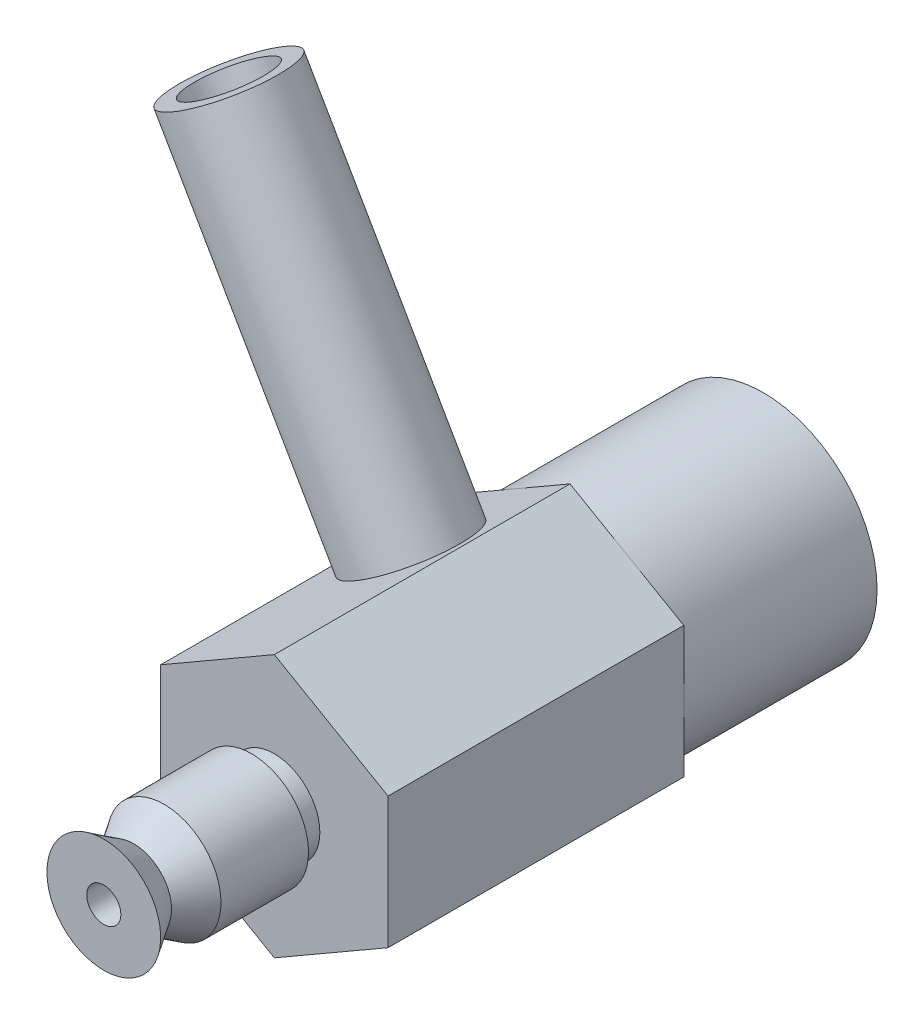
ISO-10303-21;
HEADER;
FILE_DESCRIPTION(('STEP AP214'),'2;1');
FILE_NAME('part.step','',(''),(''),'','','');
FILE_SCHEMA(('AUTOMOTIVE_DESIGN { 1 0 10303 214 1 1 1 1 }'));
ENDSEC;
DATA;
#1=APPLICATION_CONTEXT('core data for automotive mechanical design processes');
#2=APPLICATION_PROTOCOL_DEFINITION('international standard','automotive_design',2000,#1);
#3=PRODUCT_CONTEXT('',#1,'mechanical');
#4=PRODUCT('Part','Part','',(#3));
#5=PRODUCT_RELATED_PRODUCT_CATEGORY('part','',(#4));
#6=PRODUCT_DEFINITION_FORMATION('','',#4);
#7=PRODUCT_DEFINITION_CONTEXT('part definition',#1,'design');
#8=PRODUCT_DEFINITION('design','',#6,#7);
#9=PRODUCT_DEFINITION_SHAPE('','',#8);
#10=(LENGTH_UNIT() NAMED_UNIT(*) SI_UNIT(.MILLI.,.METRE.));
#11=(NAMED_UNIT(*) PLANE_ANGLE_UNIT() SI_UNIT($,.RADIAN.));
#12=(NAMED_UNIT(*) SI_UNIT($,.STERADIAN.) SOLID_ANGLE_UNIT());
#13=UNCERTAINTY_MEASURE_WITH_UNIT(LENGTH_MEASURE(1.E-05),#10,'distance_accuracy_value','');
#14=(GEOMETRIC_REPRESENTATION_CONTEXT(3) GLOBAL_UNCERTAINTY_ASSIGNED_CONTEXT((#13)) GLOBAL_UNIT_ASSIGNED_CONTEXT((#10,
#11,#12)) REPRESENTATION_CONTEXT('',''));
#15=CARTESIAN_POINT('',(0.,0.,0.));
#16=DIRECTION('',(0.,0.,1.));
#17=DIRECTION('',(1.,0.,0.));
#18=AXIS2_PLACEMENT_3D('',#15,#16,#17);
#19=CARTESIAN_POINT('',(0.,5.77350269189626,21.5));
#20=DIRECTION('',(0.5,-0.866025403784439,0.));
#21=DIRECTION('',(0.866025403784439,0.5,0.));
#22=AXIS2_PLACEMENT_3D('',#19,#20,#21);
#23=PLANE('',#22);
#24=DIRECTION('',(-0.866025403784439,-0.5,0.));
#25=VECTOR('',#24,1.);
#26=CARTESIAN_POINT('',(0.,5.77350269189626,8.5));
#27=LINE('',#26,#25);
#28=CARTESIAN_POINT('',(0.,5.77350269189626,8.5));
#29=VERTEX_POINT('',#28);
#30=CARTESIAN_POINT('',(-2.5,4.33012701892219,8.5));
#31=VERTEX_POINT('',#30);
#32=EDGE_CURVE('E234',#29,#31,#27,.T.);
#33=ORIENTED_EDGE('',*,*,#32,.T.);
#34=CARTESIAN_POINT('',(-5.,2.88675134594813,8.5));
#35=VERTEX_POINT('',#34);
#36=EDGE_CURVE('E236',#31,#35,#27,.T.);
#37=ORIENTED_EDGE('',*,*,#36,.T.);
#38=DIRECTION('',(0.,0.,-1.));
#39=VECTOR('',#38,1.);
#40=CARTESIAN_POINT('',(-5.,2.88675134594813,21.5));
#41=LINE('',#40,#39);
#42=CARTESIAN_POINT('',(-5.,2.88675134594813,21.5));
#43=VERTEX_POINT('',#42);
#44=EDGE_CURVE('E208',#43,#35,#41,.T.);
#45=ORIENTED_EDGE('',*,*,#44,.F.);
#46=DIRECTION('',(-0.866025403784439,-0.5,0.));
#47=VECTOR('',#46,1.);
#48=CARTESIAN_POINT('',(0.,5.77350269189626,21.5));
#49=LINE('',#48,#47);
#50=CARTESIAN_POINT('',(0.,5.77350269189626,21.5));
#51=VERTEX_POINT('',#50);
#52=EDGE_CURVE('E250',#51,#43,#49,.T.);
#53=ORIENTED_EDGE('',*,*,#52,.F.);
#54=DIRECTION('',(0.,0.,-1.));
#55=VECTOR('',#54,1.);
#56=CARTESIAN_POINT('',(0.,5.77350269189626,21.5));
#57=LINE('',#56,#55);
#58=EDGE_CURVE('E201',#51,#29,#57,.T.);
#59=ORIENTED_EDGE('',*,*,#58,.T.);
#60=EDGE_LOOP('',(#33,#37,#45,#53,#59));
#61=FACE_BOUND('',#60,.T.);
#62=CARTESIAN_POINT('',(-2.5,4.33012701892219,13.));
#63=DIRECTION('',(0.5,-0.866025403784439,0.));
#64=DIRECTION('',(0.866025403784439,0.5,0.));
#65=AXIS2_PLACEMENT_3D('',#62,#63,#64);
#66=CIRCLE('',#65,2.5);
#67=CARTESIAN_POINT('',(-0.3349364905389,5.58012701892219,13.));
#68=VERTEX_POINT('',#67);
#69=EDGE_CURVE('E11',#68,#68,#66,.F.);
#70=ORIENTED_EDGE('',*,*,#69,.F.);
#71=EDGE_LOOP('',(#70));
#72=FACE_BOUND('',#71,.T.);
#73=ADVANCED_FACE('F35',(#61,#72),#23,.F.);
#74=CARTESIAN_POINT('',(5.,2.88675134594813,21.5));
#75=DIRECTION('',(0.,0.,1.));
#76=DIRECTION('',(1.,0.,0.));
#77=AXIS2_PLACEMENT_3D('',#74,#75,#76);
#78=PLANE('',#77);
#79=DIRECTION('',(0.,1.,0.));
#80=VECTOR('',#79,1.);
#81=CARTESIAN_POINT('',(5.,-2.88675134594813,21.5));
#82=LINE('',#81,#80);
#83=CARTESIAN_POINT('',(5.,-2.88675134594813,21.5));
#84=VERTEX_POINT('',#83);
#85=CARTESIAN_POINT('',(5.,2.88675134594813,21.5));
#86=VERTEX_POINT('',#85);
#87=EDGE_CURVE('E224',#84,#86,#82,.T.);
#88=ORIENTED_EDGE('',*,*,#87,.T.);
#89=DIRECTION('',(-0.866025403784439,0.5,0.));
#90=VECTOR('',#89,1.);
#91=CARTESIAN_POINT('',(5.,2.88675134594813,21.5));
#92=LINE('',#91,#90);
#93=EDGE_CURVE('E252',#86,#51,#92,.T.);
#94=ORIENTED_EDGE('',*,*,#93,.T.);
#95=ORIENTED_EDGE('',*,*,#52,.T.);
#96=DIRECTION('',(0.,-1.,0.));
#97=VECTOR('',#96,1.);
#98=CARTESIAN_POINT('',(-5.,2.88675134594813,21.5));
#99=LINE('',#98,#97);
#100=CARTESIAN_POINT('',(-5.,-2.88675134594813,21.5));
#101=VERTEX_POINT('',#100);
#102=EDGE_CURVE('E248',#43,#101,#99,.T.);
#103=ORIENTED_EDGE('',*,*,#102,.T.);
#104=DIRECTION('',(0.866025403784439,-0.5,0.));
#105=VECTOR('',#104,1.);
#106=CARTESIAN_POINT('',(-5.,-2.88675134594813,21.5));
#107=LINE('',#106,#105);
#108=CARTESIAN_POINT('',(0.,-5.77350269189626,21.5));
#109=VERTEX_POINT('',#108);
#110=EDGE_CURVE('E246',#101,#109,#107,.T.);
#111=ORIENTED_EDGE('',*,*,#110,.T.);
#112=DIRECTION('',(0.866025403784439,0.5,0.));
#113=VECTOR('',#112,1.);
#114=CARTESIAN_POINT('',(0.,-5.77350269189626,21.5));
#115=LINE('',#114,#113);
#116=EDGE_CURVE('E220',#109,#84,#115,.T.);
#117=ORIENTED_EDGE('',*,*,#116,.T.);
#118=EDGE_LOOP('',(#88,#94,#95,#103,#111,#117));
#119=FACE_BOUND('',#118,.T.);
#120=CARTESIAN_POINT('',(0.,0.,21.5));
#121=DIRECTION('',(0.,0.,1.));
#122=DIRECTION('',(1.,0.,0.));
#123=AXIS2_PLACEMENT_3D('',#120,#121,#122);
#124=CIRCLE('',#123,2.);
#125=CARTESIAN_POINT('',(2.,0.,21.5));
#126=VERTEX_POINT('',#125);
#127=EDGE_CURVE('E256',#126,#126,#124,.T.);
#128=ORIENTED_EDGE('',*,*,#127,.F.);
#129=EDGE_LOOP('',(#128));
#130=FACE_BOUND('',#129,.T.);
#131=ADVANCED_FACE('F159',(#119,#130),#78,.T.);
#132=CARTESIAN_POINT('',(0.,0.,8.5));
#133=DIRECTION('',(0.,0.,-1.));
#134=DIRECTION('',(-1.,0.,0.));
#135=AXIS2_PLACEMENT_3D('',#132,#133,#134);
#136=CYLINDRICAL_SURFACE('',#135,5.);
#137=CARTESIAN_POINT('',(0.,0.,8.5));
#138=DIRECTION('',(0.,0.,1.));
#139=DIRECTION('',(1.,0.,0.));
#140=AXIS2_PLACEMENT_3D('',#137,#138,#139);
#141=CIRCLE('',#140,5.);
#142=CARTESIAN_POINT('',(5.,0.,8.5));
#143=VERTEX_POINT('',#142);
#144=CARTESIAN_POINT('',(2.5,4.3301270189222,8.5));
#145=VERTEX_POINT('',#144);
#146=EDGE_CURVE('E43',#143,#145,#141,.T.);
#147=ORIENTED_EDGE('',*,*,#146,.F.);
#148=CARTESIAN_POINT('',(2.5,-4.3301270189222,8.5));
#149=VERTEX_POINT('',#148);
#150=EDGE_CURVE('E50',#149,#143,#141,.T.);
#151=ORIENTED_EDGE('',*,*,#150,.F.);
#152=CARTESIAN_POINT('',(-2.5,-4.33012701892219,8.5));
#153=VERTEX_POINT('',#152);
#154=EDGE_CURVE('E54',#153,#149,#141,.T.);
#155=ORIENTED_EDGE('',*,*,#154,.F.);
#156=CARTESIAN_POINT('',(-5.,0.,8.5));
#157=VERTEX_POINT('',#156);
#158=EDGE_CURVE('E326',#157,#153,#141,.T.);
#159=ORIENTED_EDGE('',*,*,#158,.F.);
#160=EDGE_CURVE('E328',#31,#157,#141,.T.);
#161=ORIENTED_EDGE('',*,*,#160,.F.);
#162=EDGE_CURVE('E204',#145,#31,#141,.T.);
#163=ORIENTED_EDGE('',*,*,#162,.F.);
#164=EDGE_LOOP('',(#147,#151,#155,#159,#161,#163));
#165=FACE_BOUND('',#164,.T.);
#166=CARTESIAN_POINT('',(0.,0.,0.));
#167=DIRECTION('',(0.,0.,1.));
#168=DIRECTION('',(1.,0.,0.));
#169=AXIS2_PLACEMENT_3D('',#166,#167,#168);
#170=CIRCLE('',#169,5.);
#171=CARTESIAN_POINT('',(5.,0.,0.));
#172=VERTEX_POINT('',#171);
#173=EDGE_CURVE('E196',#172,#172,#170,.T.);
#174=ORIENTED_EDGE('',*,*,#173,.T.);
#175=EDGE_LOOP('',(#174));
#176=FACE_BOUND('',#175,.T.);
#177=ADVANCED_FACE('F37',(#165,#176),#136,.T.);
#178=CARTESIAN_POINT('',(0.,0.,0.));
#179=DIRECTION('',(0.,0.,1.));
#180=DIRECTION('',(1.,0.,0.));
#181=AXIS2_PLACEMENT_3D('',#178,#179,#180);
#182=PLANE('',#181);
#183=CARTESIAN_POINT('',(0.,0.,0.));
#184=DIRECTION('',(0.,0.,-1.));
#185=DIRECTION('',(-1.,0.,0.));
#186=AXIS2_PLACEMENT_3D('',#183,#184,#185);
#187=CIRCLE('',#186,1.65);
#188=CARTESIAN_POINT('',(-1.65,0.,0.));
#189=VERTEX_POINT('',#188);
#190=EDGE_CURVE('E116',#189,#189,#187,.T.);
#191=ORIENTED_EDGE('',*,*,#190,.F.);
#192=EDGE_LOOP('',(#191));
#193=FACE_BOUND('',#192,.T.);
#194=ORIENTED_EDGE('',*,*,#173,.F.);
#195=EDGE_LOOP('',(#194));
#196=FACE_BOUND('',#195,.T.);
#197=ADVANCED_FACE('F181',(#193,#196),#182,.F.);
#198=CARTESIAN_POINT('',(5.,2.88675134594813,8.5));
#199=DIRECTION('',(0.,0.,1.));
#200=DIRECTION('',(1.,0.,0.));
#201=AXIS2_PLACEMENT_3D('',#198,#199,#200);
#202=PLANE('',#201);
#203=DIRECTION('',(0.,1.,0.));
#204=VECTOR('',#203,1.);
#205=CARTESIAN_POINT('',(5.,-2.88675134594813,8.5));
#206=LINE('',#205,#204);
#207=CARTESIAN_POINT('',(5.,2.88675134594813,8.5));
#208=VERTEX_POINT('',#207);
#209=EDGE_CURVE('E244',#143,#208,#206,.T.);
#210=ORIENTED_EDGE('',*,*,#209,.F.);
#211=ORIENTED_EDGE('',*,*,#146,.T.);
#212=DIRECTION('',(-0.866025403784439,0.5,0.));
#213=VECTOR('',#212,1.);
#214=CARTESIAN_POINT('',(5.,2.88675134594813,8.5));
#215=LINE('',#214,#213);
#216=EDGE_CURVE('E237',#208,#145,#215,.T.);
#217=ORIENTED_EDGE('',*,*,#216,.F.);
#218=EDGE_LOOP('',(#210,#211,#217));
#219=FACE_BOUND('',#218,.T.);
#220=ADVANCED_FACE('F183',(#219),#202,.F.);
#221=EDGE_CURVE('E240',#145,#29,#215,.T.);
#222=ORIENTED_EDGE('',*,*,#221,.F.);
#223=ORIENTED_EDGE('',*,*,#162,.T.);
#224=ORIENTED_EDGE('',*,*,#32,.F.);
#225=EDGE_LOOP('',(#222,#223,#224));
#226=FACE_BOUND('',#225,.T.);
#227=ADVANCED_FACE('F189',(#226),#202,.F.);
#228=ORIENTED_EDGE('',*,*,#36,.F.);
#229=ORIENTED_EDGE('',*,*,#160,.T.);
#230=DIRECTION('',(0.,-1.,0.));
#231=VECTOR('',#230,1.);
#232=CARTESIAN_POINT('',(-5.,2.88675134594813,8.5));
#233=LINE('',#232,#231);
#234=EDGE_CURVE('E230',#35,#157,#233,.T.);
#235=ORIENTED_EDGE('',*,*,#234,.F.);
#236=EDGE_LOOP('',(#228,#229,#235));
#237=FACE_BOUND('',#236,.T.);
#238=ADVANCED_FACE('F342',(#237),#202,.F.);
#239=CARTESIAN_POINT('',(-5.,-2.88675134594813,8.5));
#240=VERTEX_POINT('',#239);
#241=EDGE_CURVE('E233',#157,#240,#233,.T.);
#242=ORIENTED_EDGE('',*,*,#241,.F.);
#243=ORIENTED_EDGE('',*,*,#158,.T.);
#244=DIRECTION('',(0.866025403784439,-0.5,0.));
#245=VECTOR('',#244,1.);
#246=CARTESIAN_POINT('',(-5.,-2.88675134594813,8.5));
#247=LINE('',#246,#245);
#248=EDGE_CURVE('E226',#240,#153,#247,.T.);
#249=ORIENTED_EDGE('',*,*,#248,.F.);
#250=EDGE_LOOP('',(#242,#243,#249));
#251=FACE_BOUND('',#250,.T.);
#252=ADVANCED_FACE('F325',(#251),#202,.F.);
#253=CARTESIAN_POINT('',(0.,-5.77350269189626,8.5));
#254=VERTEX_POINT('',#253);
#255=EDGE_CURVE('E229',#153,#254,#247,.T.);
#256=ORIENTED_EDGE('',*,*,#255,.F.);
#257=ORIENTED_EDGE('',*,*,#154,.T.);
#258=DIRECTION('',(0.866025403784439,0.5,0.));
#259=VECTOR('',#258,1.);
#260=CARTESIAN_POINT('',(0.,-5.77350269189626,8.5));
#261=LINE('',#260,#259);
#262=EDGE_CURVE('E221',#254,#149,#261,.T.);
#263=ORIENTED_EDGE('',*,*,#262,.F.);
#264=EDGE_LOOP('',(#256,#257,#263));
#265=FACE_BOUND('',#264,.T.);
#266=ADVANCED_FACE('F331',(#265),#202,.F.);
#267=CARTESIAN_POINT('',(5.,-2.88675134594813,8.5));
#268=VERTEX_POINT('',#267);
#269=EDGE_CURVE('E225',#149,#268,#261,.T.);
#270=ORIENTED_EDGE('',*,*,#269,.F.);
#271=ORIENTED_EDGE('',*,*,#150,.T.);
#272=EDGE_CURVE('E241',#268,#143,#206,.T.);
#273=ORIENTED_EDGE('',*,*,#272,.F.);
#274=EDGE_LOOP('',(#270,#271,#273));
#275=FACE_BOUND('',#274,.T.);
#276=ADVANCED_FACE('F179',(#275),#202,.F.);
#277=CARTESIAN_POINT('',(5.,-2.88675134594813,21.5));
#278=DIRECTION('',(-1.,0.,0.));
#279=DIRECTION('',(0.,-1.,0.));
#280=AXIS2_PLACEMENT_3D('',#277,#278,#279);
#281=PLANE('',#280);
#282=ORIENTED_EDGE('',*,*,#272,.T.);
#283=ORIENTED_EDGE('',*,*,#209,.T.);
#284=DIRECTION('',(0.,0.,-1.));
#285=VECTOR('',#284,1.);
#286=CARTESIAN_POINT('',(5.,2.88675134594813,21.5));
#287=LINE('',#286,#285);
#288=EDGE_CURVE('E198',#86,#208,#287,.T.);
#289=ORIENTED_EDGE('',*,*,#288,.F.);
#290=ORIENTED_EDGE('',*,*,#87,.F.);
#291=DIRECTION('',(0.,0.,-1.));
#292=VECTOR('',#291,1.);
#293=CARTESIAN_POINT('',(5.,-2.88675134594813,21.5));
#294=LINE('',#293,#292);
#295=EDGE_CURVE('E217',#84,#268,#294,.T.);
#296=ORIENTED_EDGE('',*,*,#295,.T.);
#297=EDGE_LOOP('',(#282,#283,#289,#290,#296));
#298=FACE_BOUND('',#297,.T.);
#299=ADVANCED_FACE('F176',(#298),#281,.F.);
#300=CARTESIAN_POINT('',(5.,2.88675134594813,21.5));
#301=DIRECTION('',(-0.5,-0.866025403784439,0.));
#302=DIRECTION('',(0.866025403784439,-0.5,0.));
#303=AXIS2_PLACEMENT_3D('',#300,#301,#302);
#304=PLANE('',#303);
#305=ORIENTED_EDGE('',*,*,#216,.T.);
#306=ORIENTED_EDGE('',*,*,#221,.T.);
#307=ORIENTED_EDGE('',*,*,#58,.F.);
#308=ORIENTED_EDGE('',*,*,#93,.F.);
#309=ORIENTED_EDGE('',*,*,#288,.T.);
#310=EDGE_LOOP('',(#305,#306,#307,#308,#309));
#311=FACE_BOUND('',#310,.T.);
#312=ADVANCED_FACE('F173',(#311),#304,.F.);
#313=CARTESIAN_POINT('',(-5.,2.88675134594813,21.5));
#314=DIRECTION('',(1.,0.,0.));
#315=DIRECTION('',(0.,0.,-1.));
#316=AXIS2_PLACEMENT_3D('',#313,#314,#315);
#317=PLANE('',#316);
#318=ORIENTED_EDGE('',*,*,#234,.T.);
#319=ORIENTED_EDGE('',*,*,#241,.T.);
#320=DIRECTION('',(0.,0.,-1.));
#321=VECTOR('',#320,1.);
#322=CARTESIAN_POINT('',(-5.,-2.88675134594813,21.5));
#323=LINE('',#322,#321);
#324=EDGE_CURVE('E211',#101,#240,#323,.T.);
#325=ORIENTED_EDGE('',*,*,#324,.F.);
#326=ORIENTED_EDGE('',*,*,#102,.F.);
#327=ORIENTED_EDGE('',*,*,#44,.T.);
#328=EDGE_LOOP('',(#318,#319,#325,#326,#327));
#329=FACE_BOUND('',#328,.T.);
#330=ADVANCED_FACE('F171',(#329),#317,.F.);
#331=CARTESIAN_POINT('',(-5.,-2.88675134594813,21.5));
#332=DIRECTION('',(0.5,0.866025403784438,0.));
#333=DIRECTION('',(-0.866025403784439,0.5,0.));
#334=AXIS2_PLACEMENT_3D('',#331,#332,#333);
#335=PLANE('',#334);
#336=ORIENTED_EDGE('',*,*,#248,.T.);
#337=ORIENTED_EDGE('',*,*,#255,.T.);
#338=DIRECTION('',(0.,0.,-1.));
#339=VECTOR('',#338,1.);
#340=CARTESIAN_POINT('',(0.,-5.77350269189626,21.5));
#341=LINE('',#340,#339);
#342=EDGE_CURVE('E214',#109,#254,#341,.T.);
#343=ORIENTED_EDGE('',*,*,#342,.F.);
#344=ORIENTED_EDGE('',*,*,#110,.F.);
#345=ORIENTED_EDGE('',*,*,#324,.T.);
#346=EDGE_LOOP('',(#336,#337,#343,#344,#345));
#347=FACE_BOUND('',#346,.T.);
#348=ADVANCED_FACE('F310',(#347),#335,.F.);
#349=CARTESIAN_POINT('',(0.,-5.77350269189626,21.5));
#350=DIRECTION('',(-0.5,0.866025403784439,0.));
#351=DIRECTION('',(-0.866025403784439,-0.5,0.));
#352=AXIS2_PLACEMENT_3D('',#349,#350,#351);
#353=PLANE('',#352);
#354=ORIENTED_EDGE('',*,*,#262,.T.);
#355=ORIENTED_EDGE('',*,*,#269,.T.);
#356=ORIENTED_EDGE('',*,*,#295,.F.);
#357=ORIENTED_EDGE('',*,*,#116,.F.);
#358=ORIENTED_EDGE('',*,*,#342,.T.);
#359=EDGE_LOOP('',(#354,#355,#356,#357,#358));
#360=FACE_BOUND('',#359,.T.);
#361=ADVANCED_FACE('F306',(#360),#353,.F.);
#362=CARTESIAN_POINT('',(0.,0.,22.5));
#363=DIRECTION('',(0.,0.,-1.));
#364=DIRECTION('',(-1.,0.,0.));
#365=AXIS2_PLACEMENT_3D('',#362,#363,#364);
#366=CYLINDRICAL_SURFACE('',#365,2.);
#367=CARTESIAN_POINT('',(0.,0.,22.5));
#368=DIRECTION('',(0.,0.,1.));
#369=DIRECTION('',(1.,0.,0.));
#370=AXIS2_PLACEMENT_3D('',#367,#368,#369);
#371=CIRCLE('',#370,2.);
#372=CARTESIAN_POINT('',(2.,0.,22.5));
#373=VERTEX_POINT('',#372);
#374=EDGE_CURVE('E259',#373,#373,#371,.T.);
#375=ORIENTED_EDGE('',*,*,#374,.F.);
#376=EDGE_LOOP('',(#375));
#377=FACE_BOUND('',#376,.T.);
#378=ORIENTED_EDGE('',*,*,#127,.T.);
#379=EDGE_LOOP('',(#378));
#380=FACE_BOUND('',#379,.T.);
#381=ADVANCED_FACE('F303',(#377,#380),#366,.T.);
#382=CARTESIAN_POINT('',(0.,0.,22.5));
#383=DIRECTION('',(0.,0.,1.));
#384=DIRECTION('',(1.,0.,0.));
#385=AXIS2_PLACEMENT_3D('',#382,#383,#384);
#386=PLANE('',#385);
#387=CARTESIAN_POINT('',(0.,0.,22.5));
#388=DIRECTION('',(0.,0.,-1.));
#389=DIRECTION('',(-1.,0.,0.));
#390=AXIS2_PLACEMENT_3D('',#387,#388,#389);
#391=CIRCLE('',#390,2.5);
#392=CARTESIAN_POINT('',(-2.5,0.,22.5));
#393=VERTEX_POINT('',#392);
#394=EDGE_CURVE('E260',#393,#393,#391,.T.);
#395=ORIENTED_EDGE('',*,*,#394,.T.);
#396=EDGE_LOOP('',(#395));
#397=FACE_BOUND('',#396,.T.);
#398=ORIENTED_EDGE('',*,*,#374,.T.);
#399=EDGE_LOOP('',(#398));
#400=FACE_BOUND('',#399,.T.);
#401=ADVANCED_FACE('F299',(#397,#400),#386,.F.);
#402=CARTESIAN_POINT('',(0.,0.,22.5));
#403=DIRECTION('',(0.,0.,-1.));
#404=DIRECTION('',(-1.,0.,0.));
#405=AXIS2_PLACEMENT_3D('',#402,#403,#404);
#406=CYLINDRICAL_SURFACE('',#405,2.5);
#407=ORIENTED_EDGE('',*,*,#394,.F.);
#408=EDGE_LOOP('',(#407));
#409=FACE_BOUND('',#408,.T.);
#410=CARTESIAN_POINT('',(0.,0.,26.3475325383852));
#411=DIRECTION('',(0.,0.,-1.));
#412=DIRECTION('',(-1.,0.,0.));
#413=AXIS2_PLACEMENT_3D('',#410,#411,#412);
#414=CIRCLE('',#413,2.5);
#415=CARTESIAN_POINT('',(-2.5,0.,26.3475325383852));
#416=VERTEX_POINT('',#415);
#417=EDGE_CURVE('E265',#416,#416,#414,.T.);
#418=ORIENTED_EDGE('',*,*,#417,.T.);
#419=EDGE_LOOP('',(#418));
#420=FACE_BOUND('',#419,.T.);
#421=ADVANCED_FACE('F292',(#409,#420),#406,.T.);
#422=CARTESIAN_POINT('',(0.,0.,27.6833587471366));
#423=DIRECTION('',(0.,0.,-1.));
#424=DIRECTION('',(-1.,0.,0.));
#425=AXIS2_PLACEMENT_3D('',#422,#423,#424);
#426=CONICAL_SURFACE('',#425,1.66420488302776,0.559085666289529);
#427=ORIENTED_EDGE('',*,*,#417,.F.);
#428=EDGE_LOOP('',(#427));
#429=FACE_BOUND('',#428,.T.);
#430=CARTESIAN_POINT('',(0.,0.,27.6833587471366));
#431=DIRECTION('',(0.,0.,-1.));
#432=DIRECTION('',(-1.,0.,0.));
#433=AXIS2_PLACEMENT_3D('',#430,#431,#432);
#434=CIRCLE('',#433,1.66420488302776);
#435=CARTESIAN_POINT('',(-1.66420488302776,0.,27.6833587471366));
#436=VERTEX_POINT('',#435);
#437=EDGE_CURVE('E268',#436,#436,#434,.T.);
#438=ORIENTED_EDGE('',*,*,#437,.T.);
#439=EDGE_LOOP('',(#438));
#440=FACE_BOUND('',#439,.T.);
#441=ADVANCED_FACE('F286',(#429,#440),#426,.T.);
#442=CARTESIAN_POINT('',(0.,0.,29.));
#443=DIRECTION('',(0.,0.,1.));
#444=DIRECTION('',(1.,0.,0.));
#445=AXIS2_PLACEMENT_3D('',#442,#443,#444);
#446=CONICAL_SURFACE('',#445,2.5,0.565610750948783);
#447=ORIENTED_EDGE('',*,*,#437,.F.);
#448=EDGE_LOOP('',(#447));
#449=FACE_BOUND('',#448,.T.);
#450=CARTESIAN_POINT('',(0.,0.,29.));
#451=DIRECTION('',(0.,0.,-1.));
#452=DIRECTION('',(-1.,0.,0.));
#453=AXIS2_PLACEMENT_3D('',#450,#451,#452);
#454=CIRCLE('',#453,2.5);
#455=CARTESIAN_POINT('',(-2.5,0.,29.));
#456=VERTEX_POINT('',#455);
#457=EDGE_CURVE('E271',#456,#456,#454,.T.);
#458=ORIENTED_EDGE('',*,*,#457,.T.);
#459=EDGE_LOOP('',(#458));
#460=FACE_BOUND('',#459,.T.);
#461=ADVANCED_FACE('F282',(#449,#460),#446,.T.);
#462=CARTESIAN_POINT('',(2.5,0.,29.));
#463=DIRECTION('',(0.,0.,-1.));
#464=DIRECTION('',(-1.,0.,0.));
#465=AXIS2_PLACEMENT_3D('',#462,#463,#464);
#466=PLANE('',#465);
#467=CARTESIAN_POINT('',(0.,0.,29.));
#468=DIRECTION('',(0.,0.,1.));
#469=DIRECTION('',(1.,0.,0.));
#470=AXIS2_PLACEMENT_3D('',#467,#468,#469);
#471=CIRCLE('',#470,0.75);
#472=CARTESIAN_POINT('',(0.75,0.,29.));
#473=VERTEX_POINT('',#472);
#474=EDGE_CURVE('E273',#473,#473,#471,.T.);
#475=ORIENTED_EDGE('',*,*,#474,.F.);
#476=EDGE_LOOP('',(#475));
#477=FACE_BOUND('',#476,.T.);
#478=ORIENTED_EDGE('',*,*,#457,.F.);
#479=EDGE_LOOP('',(#478));
#480=FACE_BOUND('',#479,.T.);
#481=ADVANCED_FACE('F154',(#477,#480),#466,.F.);
#482=CARTESIAN_POINT('',(0.,0.,14.));
#483=DIRECTION('',(0.,0.,1.));
#484=DIRECTION('',(1.,0.,0.));
#485=AXIS2_PLACEMENT_3D('',#482,#483,#484);
#486=CYLINDRICAL_SURFACE('',#485,0.75);
#487=CARTESIAN_POINT('',(0.75,0.,14.625));
#488=CARTESIAN_POINT('',(0.749997581033743,-0.0429644956394791,14.6335874554932));
#489=CARTESIAN_POINT('',(0.746297463008462,-0.0858410235362473,14.6429431709787));
#490=CARTESIAN_POINT('',(0.731665210910845,-0.170335432357756,14.6620843692804));
#491=CARTESIAN_POINT('',(0.720711451903178,-0.211949159401771,14.6718710552375));
#492=CARTESIAN_POINT('',(0.691800613351429,-0.292837594335742,14.6907761159271));
#493=CARTESIAN_POINT('',(0.673845253827111,-0.332112873961513,14.6998946541444));
#494=CARTESIAN_POINT('',(0.631285859929691,-0.407233309986008,14.7164604443345));
#495=CARTESIAN_POINT('',(0.606688688096747,-0.443081955418164,14.7239094069105));
#496=CARTESIAN_POINT('',(0.552151332858028,-0.509331427233968,14.7361301235306));
#497=CARTESIAN_POINT('',(0.522374633564854,-0.539853889115585,14.7409691717199));
#498=CARTESIAN_POINT('',(0.457879665679643,-0.595532173283118,14.7477137477837));
#499=CARTESIAN_POINT('',(0.423163421972011,-0.620690184129596,14.7496204739515));
#500=CARTESIAN_POINT('',(0.35265880682485,-0.663097054675359,14.7502524274163));
#501=CARTESIAN_POINT('',(0.31714078941911,-0.680794038900805,14.7492030690584));
#502=CARTESIAN_POINT('',(0.243913916725451,-0.710326953949007,14.7445108987019));
#503=CARTESIAN_POINT('',(0.206205170125816,-0.722163175263833,14.7408682152646));
#504=CARTESIAN_POINT('',(0.130063199139275,-0.739658878366545,14.7314032637664));
#505=CARTESIAN_POINT('',(0.0916409719532573,-0.74537886977853,14.7256031277043));
#506=CARTESIAN_POINT('',(0.0146594391562325,-0.750849796971762,14.7123601083081));
#507=CARTESIAN_POINT('',(-0.0238999002152687,-0.750599143748112,14.7049167881854));
#508=CARTESIAN_POINT('',(-0.102815366887602,-0.744041109374638,14.688526123235));
#509=CARTESIAN_POINT('',(-0.14312494463354,-0.737340300279151,14.6795123937593));
#510=CARTESIAN_POINT('',(-0.222092119194624,-0.717519314133369,14.6612442115262));
#511=CARTESIAN_POINT('',(-0.260748829955513,-0.704395739797667,14.6519896338291));
#512=CARTESIAN_POINT('',(-0.337752665947894,-0.671032011199389,14.6336595696009));
#513=CARTESIAN_POINT('',(-0.375950704905065,-0.650421974993014,14.6246258873078));
#514=CARTESIAN_POINT('',(-0.448494854300942,-0.602689960002137,14.608473920353));
#515=CARTESIAN_POINT('',(-0.482842592073116,-0.575570747666675,14.6013548246957));
#516=CARTESIAN_POINT('',(-0.545255197708232,-0.516682959631141,14.5902762788168));
#517=CARTESIAN_POINT('',(-0.573518318973411,-0.485147431634682,14.586200439641));
#518=CARTESIAN_POINT('',(-0.624411306944102,-0.417606474524309,14.5813588031738));
#519=CARTESIAN_POINT('',(-0.647045049181743,-0.381604146304162,14.5805907226874));
#520=CARTESIAN_POINT('',(-0.684202441336763,-0.309621561204643,14.5823947802606));
#521=CARTESIAN_POINT('',(-0.699256199792659,-0.273905737586345,14.5846853100026));
#522=CARTESIAN_POINT('',(-0.723641240589227,-0.200818260473022,14.5918215007228));
#523=CARTESIAN_POINT('',(-0.732971519672522,-0.163446317910505,14.5966676093866));
#524=CARTESIAN_POINT('',(-0.745865670912293,-0.0876328510224551,14.608400326682));
#525=CARTESIAN_POINT('',(-0.749367443495364,-0.049184191626933,14.6153079964863));
#526=CARTESIAN_POINT('',(-0.75047647755342,0.0275459510358995,14.6304011912106));
#527=CARTESIAN_POINT('',(-0.748081475559797,0.0658273644561034,14.638587205692));
#528=CARTESIAN_POINT('',(-0.737052281086641,0.144860307599577,14.6562070984));
#529=CARTESIAN_POINT('',(-0.727879911254686,0.185527056355258,14.6656871272696));
#530=CARTESIAN_POINT('',(-0.70290043948776,0.264881189881597,14.6842428880217));
#531=CARTESIAN_POINT('',(-0.68709117807061,0.303567925803815,14.6933184872484));
#532=CARTESIAN_POINT('',(-0.64843683398924,0.379342782814077,14.7104351405976));
#533=CARTESIAN_POINT('',(-0.625362009232604,0.416325475949427,14.7184280609189));
#534=CARTESIAN_POINT('',(-0.572895640856909,0.485992986003475,14.7320711251092));
#535=CARTESIAN_POINT('',(-0.543507525370072,0.518680119957351,14.7377225355655));
#536=CARTESIAN_POINT('',(-0.481200790253175,0.576755880062912,14.7457537531927));
#537=CARTESIAN_POINT('',(-0.448607209317023,0.60246823736595,14.7483122170788));
#538=CARTESIAN_POINT('',(-0.379557255472265,0.648189037981747,14.7504815104393));
#539=CARTESIAN_POINT('',(-0.3431022996064,0.668199563866055,14.7500934175675));
#540=CARTESIAN_POINT('',(-0.2697591683148,0.700890129427535,14.7465269236271));
#541=CARTESIAN_POINT('',(-0.233023521928794,0.71393308395611,14.7435145432484));
#542=CARTESIAN_POINT('',(-0.158222501905655,0.734143761017213,14.735222827963));
#543=CARTESIAN_POINT('',(-0.120156997036443,0.741310902000049,14.7299432687445));
#544=CARTESIAN_POINT('',(-0.0427683196834949,0.749814912803922,14.7174647855781));
#545=CARTESIAN_POINT('',(-0.00343666926698729,0.751010172854004,14.7102234987467));
#546=CARTESIAN_POINT('',(0.0746987675298816,0.7472961090606,14.6945515605175));
#547=CARTESIAN_POINT('',(0.113502339576387,0.742384377097216,14.6861204411052));
#548=CARTESIAN_POINT('',(0.192659848491621,0.726041053756364,14.6681739596142));
#549=CARTESIAN_POINT('',(0.232911143387405,0.714147223470522,14.6586247319709));
#550=CARTESIAN_POINT('',(0.310989746929829,0.68376973472015,14.6400298891159));
#551=CARTESIAN_POINT('',(0.348816138762476,0.665283600953828,14.6309844645511));
#552=CARTESIAN_POINT('',(0.422094083039458,0.62145595776022,14.6142097841884));
#553=CARTESIAN_POINT('',(0.457452259974398,0.595940612710387,14.6065233442123));
#554=CARTESIAN_POINT('',(0.523458746860035,0.538878140982387,14.5938493293999));
#555=CARTESIAN_POINT('',(0.554111482105173,0.507336745040825,14.5888592075048));
#556=CARTESIAN_POINT('',(0.607487838867734,0.441714230366341,14.5825947209545));
#557=CARTESIAN_POINT('',(0.630633376761746,0.408000258100434,14.5810700514687));
#558=CARTESIAN_POINT('',(0.671137682756708,0.337246082386277,14.5812123627165));
#559=CARTESIAN_POINT('',(0.688495006254061,0.300205051505212,14.5828801395115));
#560=CARTESIAN_POINT('',(0.716050358432558,0.226347831583879,14.5889712291961));
#561=CARTESIAN_POINT('',(0.726617249661228,0.189652995232136,14.5932221615406));
#562=CARTESIAN_POINT('',(0.742028707004497,0.115435624133462,14.6038080207354));
#563=CARTESIAN_POINT('',(0.746884005695662,0.0779147771851393,14.6101390102343));
#564=CARTESIAN_POINT('',(0.749638183864647,0.0269442120414298,14.6196917876249));
#565=CARTESIAN_POINT('',(0.750000758256674,0.013467784204303,14.6223081495378));
#566=CARTESIAN_POINT('',(0.75,0.,14.625));
#567=B_SPLINE_CURVE_WITH_KNOTS('',3,(#487,#488,#489,#490,#491,#492,#493,#494,#495,#496,#497,
#498,#499,#500,#501,#502,#503,#504,#505,#506,#507,#508,#509,#510,#511,#512,#513,#514,#515,#516,
#517,#518,#519,#520,#521,#522,#523,#524,#525,#526,#527,#528,#529,#530,#531,#532,#533,#534,#535,
#536,#537,#538,#539,#540,#541,#542,#543,#544,#545,#546,#547,#548,#549,#550,#551,#552,#553,#554,
#555,#556,#557,#558,#559,#560,#561,#562,#563,#564,#565,#566),.UNSPECIFIED.,.T.,.F.,(4,2,2,2,2,2,
2,2,2,2,2,2,2,2,2,2,2,2,2,2,2,2,2,2,2,2,2,2,2,2,2,2,2,2,2,2,2,2,2,4),(0.,0.131407027848379,
0.263207587620334,0.39497578952016,0.526608361696749,0.654661390372532,0.782662076264927,
0.90117196132388,1.01967597178441,1.13699642138575,1.25434809455885,1.37934320374939,
1.50440449997072,1.63674771331273,1.76903477907678,1.89595907564453,2.02279574810538,
2.13872327092254,2.25467110864353,2.37184658027629,2.48906703656021,2.61675763072791,
2.74448980453248,2.87675418224633,3.00894692080264,3.13306987024413,3.25714742598241,
3.37390258792991,3.49066930414708,3.61019216085318,3.72976216297446,3.85831806977145,
3.9869222981159,4.11904757450635,4.25104782046362,4.3731617261881,4.49530608593177,
4.61007863309512,4.72463516645214,4.76582642140928),.UNSPECIFIED.);
#568=CARTESIAN_POINT('',(0.75,0.,14.625));
#569=VERTEX_POINT('',#568);
#570=EDGE_CURVE('E125',#569,#569,#567,.T.);
#571=ORIENTED_EDGE('',*,*,#570,.T.);
#572=EDGE_LOOP('',(#571));
#573=FACE_BOUND('',#572,.T.);
#574=ORIENTED_EDGE('',*,*,#474,.T.);
#575=EDGE_LOOP('',(#574));
#576=FACE_BOUND('',#575,.T.);
#577=ADVANCED_FACE('F135',(#573,#576),#486,.F.);
#578=CARTESIAN_POINT('',(-10.5,18.1865334794732,13.));
#579=DIRECTION('',(0.5,-0.866025403784439,0.));
#580=DIRECTION('',(0.866025403784439,0.5,0.));
#581=AXIS2_PLACEMENT_3D('',#578,#579,#580);
#582=CYLINDRICAL_SURFACE('',#581,2.5);
#583=CARTESIAN_POINT('',(-10.5,18.1865334794732,13.));
#584=DIRECTION('',(-0.5,0.866025403784439,0.));
#585=DIRECTION('',(-0.866025403784439,-0.5,0.));
#586=AXIS2_PLACEMENT_3D('',#583,#584,#585);
#587=CIRCLE('',#586,2.5);
#588=CARTESIAN_POINT('',(-12.6650635094611,16.9365334794732,13.));
#589=VERTEX_POINT('',#588);
#590=EDGE_CURVE('E133',#589,#589,#587,.T.);
#591=ORIENTED_EDGE('',*,*,#590,.F.);
#592=EDGE_LOOP('',(#591));
#593=FACE_BOUND('',#592,.T.);
#594=ORIENTED_EDGE('',*,*,#69,.T.);
#595=EDGE_LOOP('',(#594));
#596=FACE_BOUND('',#595,.T.);
#597=ADVANCED_FACE('F147',(#593,#596),#582,.T.);
#598=CARTESIAN_POINT('',(-10.5,18.1865334794732,13.));
#599=DIRECTION('',(-0.5,0.866025403784439,0.));
#600=DIRECTION('',(-0.866025403784439,-0.5,0.));
#601=AXIS2_PLACEMENT_3D('',#598,#599,#600);
#602=PLANE('',#601);
#603=CARTESIAN_POINT('',(-10.5,18.1865334794732,13.));
#604=DIRECTION('',(-0.5,0.866025403784439,0.));
#605=DIRECTION('',(-0.866025403784439,-0.5,0.));
#606=AXIS2_PLACEMENT_3D('',#603,#604,#605);
#607=CIRCLE('',#606,1.75);
#608=CARTESIAN_POINT('',(-12.0155444566228,17.3115334794732,13.));
#609=VERTEX_POINT('',#608);
#610=EDGE_CURVE('E115',#609,#609,#607,.T.);
#611=ORIENTED_EDGE('',*,*,#610,.F.);
#612=EDGE_LOOP('',(#611));
#613=FACE_BOUND('',#612,.T.);
#614=ORIENTED_EDGE('',*,*,#590,.T.);
#615=EDGE_LOOP('',(#614));
#616=FACE_BOUND('',#615,.T.);
#617=ADVANCED_FACE('F144',(#613,#616),#602,.T.);
#618=CARTESIAN_POINT('',(0.499999999999994,-0.866025403784419,13.));
#619=DIRECTION('',(-0.5,0.866025403784439,0.));
#620=DIRECTION('',(-0.866025403784439,-0.5,0.));
#621=AXIS2_PLACEMENT_3D('',#618,#619,#620);
#622=CYLINDRICAL_SURFACE('',#621,1.75);
#623=ORIENTED_EDGE('',*,*,#610,.T.);
#624=EDGE_LOOP('',(#623));
#625=FACE_BOUND('',#624,.T.);
#626=CARTESIAN_POINT('',(0.499999999999994,-0.866025403784419,13.));
#627=DIRECTION('',(-0.5,0.866025403784439,0.));
#628=DIRECTION('',(-0.866025403784439,-0.5,0.));
#629=AXIS2_PLACEMENT_3D('',#626,#627,#628);
#630=CIRCLE('',#629,1.75);
#631=CARTESIAN_POINT('',(-1.01554445662278,-1.74102540378442,13.));
#632=VERTEX_POINT('',#631);
#633=EDGE_CURVE('E119',#632,#632,#630,.T.);
#634=ORIENTED_EDGE('',*,*,#633,.F.);
#635=EDGE_LOOP('',(#634));
#636=FACE_BOUND('',#635,.T.);
#637=ORIENTED_EDGE('',*,*,#570,.F.);
#638=EDGE_LOOP('',(#637));
#639=FACE_BOUND('',#638,.T.);
#640=ADVANCED_FACE('F139',(#625,#636,#639),#622,.F.);
#641=CARTESIAN_POINT('',(0.499999999999994,-0.866025403784419,13.));
#642=DIRECTION('',(-0.5,0.866025403784439,0.));
#643=DIRECTION('',(-0.866025403784439,-0.5,0.));
#644=AXIS2_PLACEMENT_3D('',#641,#642,#643);
#645=PLANE('',#644);
#646=ORIENTED_EDGE('',*,*,#633,.T.);
#647=EDGE_LOOP('',(#646));
#648=FACE_BOUND('',#647,.T.);
#649=ADVANCED_FACE('F109',(#648),#645,.T.);
#650=CARTESIAN_POINT('',(0.,0.,10.1));
#651=DIRECTION('',(0.,0.,-1.));
#652=DIRECTION('',(-1.,0.,0.));
#653=AXIS2_PLACEMENT_3D('',#650,#651,#652);
#654=CONICAL_SURFACE('',#653,1.65,1.02974425867665);
#655=CARTESIAN_POINT('',(0.,0.,11.0914200213955));
#656=VERTEX_POINT('',#655);
#657=VERTEX_LOOP('',#656);
#658=FACE_BOUND('',#657,.T.);
#659=CARTESIAN_POINT('',(0.,0.,10.1));
#660=DIRECTION('',(0.,0.,-1.));
#661=DIRECTION('',(-1.,0.,0.));
#662=AXIS2_PLACEMENT_3D('',#659,#660,#661);
#663=CIRCLE('',#662,1.65);
#664=CARTESIAN_POINT('',(-1.65,0.,10.1));
#665=VERTEX_POINT('',#664);
#666=EDGE_CURVE('E113',#665,#665,#663,.T.);
#667=ORIENTED_EDGE('',*,*,#666,.T.);
#668=EDGE_LOOP('',(#667));
#669=FACE_BOUND('',#668,.T.);
#670=ADVANCED_FACE('F105',(#658,#669),#654,.F.);
#671=CARTESIAN_POINT('',(0.,0.,0.));
#672=DIRECTION('',(0.,0.,-1.));
#673=DIRECTION('',(-1.,0.,0.));
#674=AXIS2_PLACEMENT_3D('',#671,#672,#673);
#675=CYLINDRICAL_SURFACE('',#674,1.65);
#676=ORIENTED_EDGE('',*,*,#666,.F.);
#677=EDGE_LOOP('',(#676));
#678=FACE_BOUND('',#677,.T.);
#679=ORIENTED_EDGE('',*,*,#190,.T.);
#680=EDGE_LOOP('',(#679));
#681=FACE_BOUND('',#680,.T.);
#682=ADVANCED_FACE('F108',(#678,#681),#675,.F.);
#683=CLOSED_SHELL('',(#73,#131,#177,#197,#220,#227,#238,#252,#266,#276,#299,#312,#330,#348,#361,
#381,#401,#421,#441,#461,#481,#577,#597,#617,#640,#649,#670,#682));
#684=MANIFOLD_SOLID_BREP('B2',#683);
#685=ADVANCED_BREP_SHAPE_REPRESENTATION('',(#18,#684),#14);
#686=SHAPE_DEFINITION_REPRESENTATION(#9,#685);
ENDSEC;
END-ISO-10303-21;
